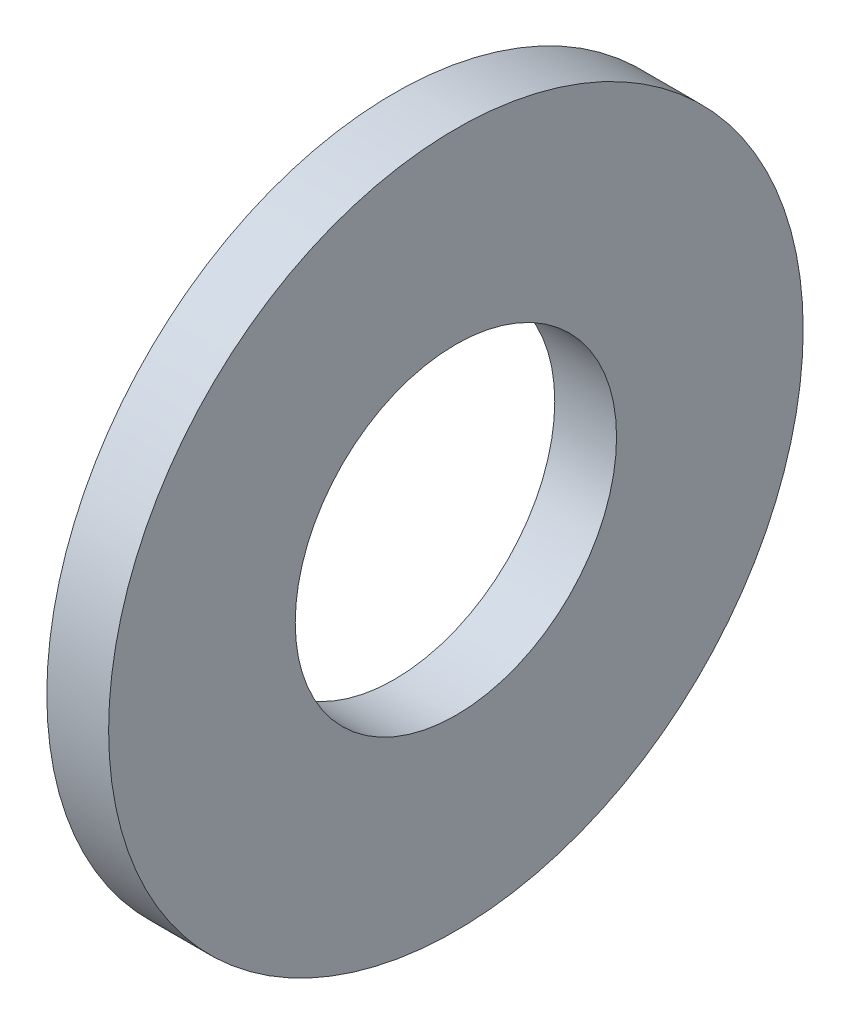
ISO-10303-21;
HEADER;
FILE_DESCRIPTION(('STEP AP214'),'2;1');
FILE_NAME('part.step','',(''),(''),'','','');
FILE_SCHEMA(('AUTOMOTIVE_DESIGN { 1 0 10303 214 1 1 1 1 }'));
ENDSEC;
DATA;
#1=APPLICATION_CONTEXT('core data for automotive mechanical design processes');
#2=APPLICATION_PROTOCOL_DEFINITION('international standard','automotive_design',2000,#1);
#3=PRODUCT_CONTEXT('',#1,'mechanical');
#4=PRODUCT('Part','Part','',(#3));
#5=PRODUCT_RELATED_PRODUCT_CATEGORY('part','',(#4));
#6=PRODUCT_DEFINITION_FORMATION('','',#4);
#7=PRODUCT_DEFINITION_CONTEXT('part definition',#1,'design');
#8=PRODUCT_DEFINITION('design','',#6,#7);
#9=PRODUCT_DEFINITION_SHAPE('','',#8);
#10=(LENGTH_UNIT() NAMED_UNIT(*) SI_UNIT(.MILLI.,.METRE.));
#11=(NAMED_UNIT(*) PLANE_ANGLE_UNIT() SI_UNIT($,.RADIAN.));
#12=(NAMED_UNIT(*) SI_UNIT($,.STERADIAN.) SOLID_ANGLE_UNIT());
#13=UNCERTAINTY_MEASURE_WITH_UNIT(LENGTH_MEASURE(1.E-05),#10,'distance_accuracy_value','');
#14=(GEOMETRIC_REPRESENTATION_CONTEXT(3) GLOBAL_UNCERTAINTY_ASSIGNED_CONTEXT((#13)) GLOBAL_UNIT_ASSIGNED_CONTEXT((#10,
#11,#12)) REPRESENTATION_CONTEXT('',''));
#15=CARTESIAN_POINT('',(0.,0.,0.));
#16=DIRECTION('',(0.,0.,1.));
#17=DIRECTION('',(1.,0.,0.));
#18=AXIS2_PLACEMENT_3D('',#15,#16,#17);
#19=CARTESIAN_POINT('',(1.27,0.,0.));
#20=DIRECTION('',(1.,0.,0.));
#21=DIRECTION('',(0.,0.,-1.));
#22=AXIS2_PLACEMENT_3D('',#19,#20,#21);
#23=PLANE('',#22);
#24=CARTESIAN_POINT('',(1.27,0.,0.));
#25=DIRECTION('',(1.,0.,0.));
#26=DIRECTION('',(0.,0.,-1.));
#27=AXIS2_PLACEMENT_3D('',#24,#25,#26);
#28=CIRCLE('',#27,7.1374);
#29=CARTESIAN_POINT('',(1.27,0.,-7.1374));
#30=VERTEX_POINT('',#29);
#31=EDGE_CURVE('E10',#30,#30,#28,.T.);
#32=ORIENTED_EDGE('',*,*,#31,.T.);
#33=EDGE_LOOP('',(#32));
#34=FACE_BOUND('',#33,.T.);
#35=CARTESIAN_POINT('',(1.27,0.,0.));
#36=DIRECTION('',(1.,0.,0.));
#37=DIRECTION('',(0.,0.,-1.));
#38=AXIS2_PLACEMENT_3D('',#35,#36,#37);
#39=CIRCLE('',#38,3.302);
#40=CARTESIAN_POINT('',(1.27,0.,-3.302));
#41=VERTEX_POINT('',#40);
#42=EDGE_CURVE('E48',#41,#41,#39,.T.);
#43=ORIENTED_EDGE('',*,*,#42,.F.);
#44=EDGE_LOOP('',(#43));
#45=FACE_BOUND('',#44,.T.);
#46=ADVANCED_FACE('F34',(#34,#45),#23,.T.);
#47=CARTESIAN_POINT('',(0.,0.,0.));
#48=DIRECTION('',(1.,0.,0.));
#49=DIRECTION('',(0.,0.,-1.));
#50=AXIS2_PLACEMENT_3D('',#47,#48,#49);
#51=PLANE('',#50);
#52=CARTESIAN_POINT('',(0.,0.,0.));
#53=DIRECTION('',(1.,0.,0.));
#54=DIRECTION('',(0.,0.,-1.));
#55=AXIS2_PLACEMENT_3D('',#52,#53,#54);
#56=CIRCLE('',#55,7.1374);
#57=CARTESIAN_POINT('',(0.,0.,-7.1374));
#58=VERTEX_POINT('',#57);
#59=EDGE_CURVE('E38',#58,#58,#56,.T.);
#60=ORIENTED_EDGE('',*,*,#59,.F.);
#61=EDGE_LOOP('',(#60));
#62=FACE_BOUND('',#61,.T.);
#63=CARTESIAN_POINT('',(0.,0.,0.));
#64=DIRECTION('',(1.,0.,0.));
#65=DIRECTION('',(0.,0.,-1.));
#66=AXIS2_PLACEMENT_3D('',#63,#64,#65);
#67=CIRCLE('',#66,3.302);
#68=CARTESIAN_POINT('',(0.,0.,-3.302));
#69=VERTEX_POINT('',#68);
#70=EDGE_CURVE('E50',#69,#69,#67,.T.);
#71=ORIENTED_EDGE('',*,*,#70,.T.);
#72=EDGE_LOOP('',(#71));
#73=FACE_BOUND('',#72,.T.);
#74=ADVANCED_FACE('F61',(#62,#73),#51,.F.);
#75=CARTESIAN_POINT('',(1.27,0.,0.));
#76=DIRECTION('',(-1.,0.,0.));
#77=DIRECTION('',(0.,0.,1.));
#78=AXIS2_PLACEMENT_3D('',#75,#76,#77);
#79=CYLINDRICAL_SURFACE('',#78,7.1374);
#80=ORIENTED_EDGE('',*,*,#31,.F.);
#81=EDGE_LOOP('',(#80));
#82=FACE_BOUND('',#81,.T.);
#83=ORIENTED_EDGE('',*,*,#59,.T.);
#84=EDGE_LOOP('',(#83));
#85=FACE_BOUND('',#84,.T.);
#86=ADVANCED_FACE('F36',(#82,#85),#79,.T.);
#87=CARTESIAN_POINT('',(1.27,0.,0.));
#88=DIRECTION('',(-1.,0.,0.));
#89=DIRECTION('',(0.,0.,1.));
#90=AXIS2_PLACEMENT_3D('',#87,#88,#89);
#91=CYLINDRICAL_SURFACE('',#90,3.302);
#92=ORIENTED_EDGE('',*,*,#42,.T.);
#93=EDGE_LOOP('',(#92));
#94=FACE_BOUND('',#93,.T.);
#95=ORIENTED_EDGE('',*,*,#70,.F.);
#96=EDGE_LOOP('',(#95));
#97=FACE_BOUND('',#96,.T.);
#98=ADVANCED_FACE('F57',(#94,#97),#91,.F.);
#99=CLOSED_SHELL('',(#46,#74,#86,#98));
#100=MANIFOLD_SOLID_BREP('B2',#99);
#101=ADVANCED_BREP_SHAPE_REPRESENTATION('',(#18,#100),#14);
#102=SHAPE_DEFINITION_REPRESENTATION(#9,#101);
ENDSEC;
END-ISO-10303-21;
